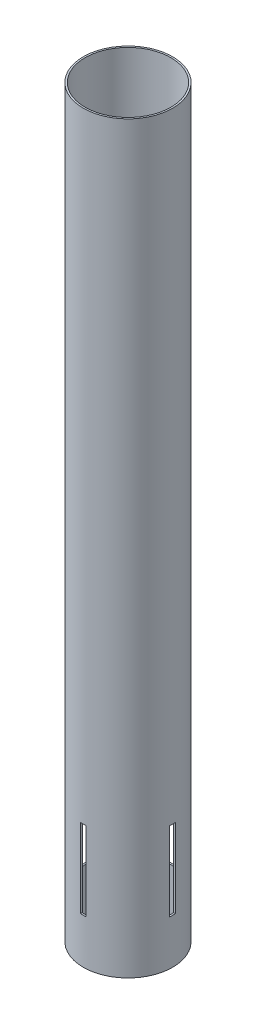
ISO-10303-21;
HEADER;
FILE_DESCRIPTION(('STEP AP214'),'2;1');
FILE_NAME('part.step','',(''),(''),'','','');
FILE_SCHEMA(('AUTOMOTIVE_DESIGN { 1 0 10303 214 1 1 1 1 }'));
ENDSEC;
DATA;
#1=APPLICATION_CONTEXT('core data for automotive mechanical design processes');
#2=APPLICATION_PROTOCOL_DEFINITION('international standard','automotive_design',2000,#1);
#3=PRODUCT_CONTEXT('',#1,'mechanical');
#4=PRODUCT('Part','Part','',(#3));
#5=PRODUCT_RELATED_PRODUCT_CATEGORY('part','',(#4));
#6=PRODUCT_DEFINITION_FORMATION('','',#4);
#7=PRODUCT_DEFINITION_CONTEXT('part definition',#1,'design');
#8=PRODUCT_DEFINITION('design','',#6,#7);
#9=PRODUCT_DEFINITION_SHAPE('','',#8);
#10=(LENGTH_UNIT() NAMED_UNIT(*) SI_UNIT(.MILLI.,.METRE.));
#11=(NAMED_UNIT(*) PLANE_ANGLE_UNIT() SI_UNIT($,.RADIAN.));
#12=(NAMED_UNIT(*) SI_UNIT($,.STERADIAN.) SOLID_ANGLE_UNIT());
#13=UNCERTAINTY_MEASURE_WITH_UNIT(LENGTH_MEASURE(1.E-05),#10,'distance_accuracy_value','');
#14=(GEOMETRIC_REPRESENTATION_CONTEXT(3) GLOBAL_UNCERTAINTY_ASSIGNED_CONTEXT((#13)) GLOBAL_UNIT_ASSIGNED_CONTEXT((#10,
#11,#12)) REPRESENTATION_CONTEXT('',''));
#15=CARTESIAN_POINT('',(0.,0.,0.));
#16=DIRECTION('',(0.,0.,1.));
#17=DIRECTION('',(1.,0.,0.));
#18=AXIS2_PLACEMENT_3D('',#15,#16,#17);
#19=CARTESIAN_POINT('',(0.,660.,0.));
#20=DIRECTION('',(0.,1.,0.));
#21=DIRECTION('',(0.,0.,1.));
#22=AXIS2_PLACEMENT_3D('',#19,#20,#21);
#23=PLANE('',#22);
#24=CARTESIAN_POINT('',(0.,660.,0.));
#25=DIRECTION('',(0.,1.,0.));
#26=DIRECTION('',(0.,0.,1.));
#27=AXIS2_PLACEMENT_3D('',#24,#25,#26);
#28=CIRCLE('',#27,39.6);
#29=CARTESIAN_POINT('',(0.,660.,39.6));
#30=VERTEX_POINT('',#29);
#31=EDGE_CURVE('E323',#30,#30,#28,.T.);
#32=ORIENTED_EDGE('',*,*,#31,.T.);
#33=EDGE_LOOP('',(#32));
#34=FACE_BOUND('',#33,.T.);
#35=CARTESIAN_POINT('',(0.,660.,0.));
#36=DIRECTION('',(0.,1.,0.));
#37=DIRECTION('',(0.,0.,1.));
#38=AXIS2_PLACEMENT_3D('',#35,#36,#37);
#39=CIRCLE('',#38,38.1);
#40=CARTESIAN_POINT('',(0.,660.,38.1));
#41=VERTEX_POINT('',#40);
#42=EDGE_CURVE('E315',#41,#41,#39,.T.);
#43=ORIENTED_EDGE('',*,*,#42,.F.);
#44=EDGE_LOOP('',(#43));
#45=FACE_BOUND('',#44,.T.);
#46=ADVANCED_FACE('F39',(#34,#45),#23,.T.);
#47=CARTESIAN_POINT('',(0.,0.,0.));
#48=DIRECTION('',(0.,1.,0.));
#49=DIRECTION('',(0.,0.,1.));
#50=AXIS2_PLACEMENT_3D('',#47,#48,#49);
#51=PLANE('',#50);
#52=CARTESIAN_POINT('',(0.,0.,0.));
#53=DIRECTION('',(0.,1.,0.));
#54=DIRECTION('',(0.,0.,1.));
#55=AXIS2_PLACEMENT_3D('',#52,#53,#54);
#56=CIRCLE('',#55,39.6);
#57=CARTESIAN_POINT('',(0.,0.,39.6));
#58=VERTEX_POINT('',#57);
#59=EDGE_CURVE('E319',#58,#58,#56,.T.);
#60=ORIENTED_EDGE('',*,*,#59,.F.);
#61=EDGE_LOOP('',(#60));
#62=FACE_BOUND('',#61,.T.);
#63=CARTESIAN_POINT('',(0.,0.,0.));
#64=DIRECTION('',(0.,1.,0.));
#65=DIRECTION('',(0.,0.,1.));
#66=AXIS2_PLACEMENT_3D('',#63,#64,#65);
#67=CIRCLE('',#66,38.1);
#68=CARTESIAN_POINT('',(0.,0.,38.1));
#69=VERTEX_POINT('',#68);
#70=EDGE_CURVE('E314',#69,#69,#67,.T.);
#71=ORIENTED_EDGE('',*,*,#70,.T.);
#72=EDGE_LOOP('',(#71));
#73=FACE_BOUND('',#72,.T.);
#74=ADVANCED_FACE('F372',(#62,#73),#51,.F.);
#75=CARTESIAN_POINT('',(0.,660.,0.));
#76=DIRECTION('',(0.,-1.,0.));
#77=DIRECTION('',(0.,0.,-1.));
#78=AXIS2_PLACEMENT_3D('',#75,#76,#77);
#79=CYLINDRICAL_SURFACE('',#78,39.6);
#80=DIRECTION('',(0.,-1.,0.));
#81=VECTOR('',#80,1.);
#82=CARTESIAN_POINT('',(-39.5210070721888,660.,2.50000000000014));
#83=LINE('',#82,#81);
#84=CARTESIAN_POINT('',(-39.5210070721888,110.,2.50000000000014));
#85=VERTEX_POINT('',#84);
#86=CARTESIAN_POINT('',(-39.5210070721888,40.,2.50000000000014));
#87=VERTEX_POINT('',#86);
#88=EDGE_CURVE('E244',#85,#87,#83,.T.);
#89=ORIENTED_EDGE('',*,*,#88,.T.);
#90=CARTESIAN_POINT('',(0.,40.,0.));
#91=DIRECTION('',(0.,-1.,0.));
#92=DIRECTION('',(0.,0.,-1.));
#93=AXIS2_PLACEMENT_3D('',#90,#91,#92);
#94=CIRCLE('',#93,39.6);
#95=CARTESIAN_POINT('',(-39.5210070721888,40.,-2.49999999999986));
#96=VERTEX_POINT('',#95);
#97=EDGE_CURVE('E55',#87,#96,#94,.T.);
#98=ORIENTED_EDGE('',*,*,#97,.T.);
#99=DIRECTION('',(0.,-1.,0.));
#100=VECTOR('',#99,1.);
#101=CARTESIAN_POINT('',(-39.5210070721888,660.,-2.49999999999986));
#102=LINE('',#101,#100);
#103=CARTESIAN_POINT('',(-39.5210070721888,110.,-2.49999999999986));
#104=VERTEX_POINT('',#103);
#105=EDGE_CURVE('E272',#96,#104,#102,.F.);
#106=ORIENTED_EDGE('',*,*,#105,.T.);
#107=CARTESIAN_POINT('',(0.,110.,0.));
#108=DIRECTION('',(0.,1.,0.));
#109=DIRECTION('',(0.,0.,1.));
#110=AXIS2_PLACEMENT_3D('',#107,#108,#109);
#111=CIRCLE('',#110,39.6);
#112=EDGE_CURVE('E232',#104,#85,#111,.T.);
#113=ORIENTED_EDGE('',*,*,#112,.T.);
#114=EDGE_LOOP('',(#89,#98,#106,#113));
#115=FACE_BOUND('',#114,.T.);
#116=CARTESIAN_POINT('',(-2.5,110.,39.5210070721888));
#117=VERTEX_POINT('',#116);
#118=CARTESIAN_POINT('',(2.5,110.,39.5210070721888));
#119=VERTEX_POINT('',#118);
#120=EDGE_CURVE('E280',#117,#119,#111,.T.);
#121=ORIENTED_EDGE('',*,*,#120,.T.);
#122=DIRECTION('',(0.,-1.,0.));
#123=VECTOR('',#122,1.);
#124=CARTESIAN_POINT('',(2.5,660.,39.5210070721888));
#125=LINE('',#124,#123);
#126=CARTESIAN_POINT('',(2.5,40.,39.5210070721888));
#127=VERTEX_POINT('',#126);
#128=EDGE_CURVE('E265',#119,#127,#125,.T.);
#129=ORIENTED_EDGE('',*,*,#128,.T.);
#130=CARTESIAN_POINT('',(-2.5,40.,39.5210070721888));
#131=VERTEX_POINT('',#130);
#132=EDGE_CURVE('E273',#127,#131,#94,.T.);
#133=ORIENTED_EDGE('',*,*,#132,.T.);
#134=DIRECTION('',(0.,-1.,0.));
#135=VECTOR('',#134,1.);
#136=CARTESIAN_POINT('',(-2.5,660.,39.5210070721888));
#137=LINE('',#136,#135);
#138=EDGE_CURVE('E249',#131,#117,#137,.F.);
#139=ORIENTED_EDGE('',*,*,#138,.T.);
#140=EDGE_LOOP('',(#121,#129,#133,#139));
#141=FACE_BOUND('',#140,.T.);
#142=DIRECTION('',(0.,-1.,0.));
#143=VECTOR('',#142,1.);
#144=CARTESIAN_POINT('',(39.5210070721888,660.,-2.50000000000014));
#145=LINE('',#144,#143);
#146=CARTESIAN_POINT('',(39.5210070721888,110.,-2.50000000000014));
#147=VERTEX_POINT('',#146);
#148=CARTESIAN_POINT('',(39.5210070721888,40.,-2.50000000000014));
#149=VERTEX_POINT('',#148);
#150=EDGE_CURVE('E276',#147,#149,#145,.T.);
#151=ORIENTED_EDGE('',*,*,#150,.T.);
#152=CARTESIAN_POINT('',(39.5210070721889,40.,2.49999999999959));
#153=VERTEX_POINT('',#152);
#154=EDGE_CURVE('E269',#149,#153,#94,.T.);
#155=ORIENTED_EDGE('',*,*,#154,.T.);
#156=DIRECTION('',(0.,-1.,0.));
#157=VECTOR('',#156,1.);
#158=CARTESIAN_POINT('',(39.5210070721889,660.,2.49999999999959));
#159=LINE('',#158,#157);
#160=CARTESIAN_POINT('',(39.5210070721889,110.,2.49999999999959));
#161=VERTEX_POINT('',#160);
#162=EDGE_CURVE('E246',#153,#161,#159,.F.);
#163=ORIENTED_EDGE('',*,*,#162,.T.);
#164=EDGE_CURVE('E175',#161,#147,#111,.T.);
#165=ORIENTED_EDGE('',*,*,#164,.T.);
#166=EDGE_LOOP('',(#151,#155,#163,#165));
#167=FACE_BOUND('',#166,.T.);
#168=DIRECTION('',(0.,-1.,0.));
#169=VECTOR('',#168,1.);
#170=CARTESIAN_POINT('',(2.5,660.,-39.5210070721888));
#171=LINE('',#170,#169);
#172=CARTESIAN_POINT('',(2.5,40.,-39.5210070721888));
#173=VERTEX_POINT('',#172);
#174=CARTESIAN_POINT('',(2.5,110.,-39.5210070721888));
#175=VERTEX_POINT('',#174);
#176=EDGE_CURVE('E303',#173,#175,#171,.F.);
#177=ORIENTED_EDGE('',*,*,#176,.T.);
#178=CARTESIAN_POINT('',(0.,110.,0.));
#179=DIRECTION('',(0.,1.,0.));
#180=DIRECTION('',(0.,0.,1.));
#181=AXIS2_PLACEMENT_3D('',#178,#179,#180);
#182=CIRCLE('',#181,39.6);
#183=CARTESIAN_POINT('',(-2.5,110.,-39.5210070721888));
#184=VERTEX_POINT('',#183);
#185=EDGE_CURVE('E307',#175,#184,#182,.T.);
#186=ORIENTED_EDGE('',*,*,#185,.T.);
#187=DIRECTION('',(0.,-1.,0.));
#188=VECTOR('',#187,1.);
#189=CARTESIAN_POINT('',(-2.5,660.,-39.5210070721888));
#190=LINE('',#189,#188);
#191=CARTESIAN_POINT('',(-2.5,40.,-39.5210070721888));
#192=VERTEX_POINT('',#191);
#193=EDGE_CURVE('E310',#184,#192,#190,.T.);
#194=ORIENTED_EDGE('',*,*,#193,.T.);
#195=CARTESIAN_POINT('',(0.,40.,0.));
#196=DIRECTION('',(0.,-1.,0.));
#197=DIRECTION('',(0.,0.,-1.));
#198=AXIS2_PLACEMENT_3D('',#195,#196,#197);
#199=CIRCLE('',#198,39.6);
#200=EDGE_CURVE('E290',#192,#173,#199,.T.);
#201=ORIENTED_EDGE('',*,*,#200,.T.);
#202=EDGE_LOOP('',(#177,#186,#194,#201));
#203=FACE_BOUND('',#202,.T.);
#204=ORIENTED_EDGE('',*,*,#31,.F.);
#205=EDGE_LOOP('',(#204));
#206=FACE_BOUND('',#205,.T.);
#207=ORIENTED_EDGE('',*,*,#59,.T.);
#208=EDGE_LOOP('',(#207));
#209=FACE_BOUND('',#208,.T.);
#210=ADVANCED_FACE('F41',(#115,#141,#167,#203,#206,#209),#79,.T.);
#211=CARTESIAN_POINT('',(0.,660.,0.));
#212=DIRECTION('',(0.,-1.,0.));
#213=DIRECTION('',(0.,0.,-1.));
#214=AXIS2_PLACEMENT_3D('',#211,#212,#213);
#215=CYLINDRICAL_SURFACE('',#214,38.1);
#216=DIRECTION('',(0.,-1.,0.));
#217=VECTOR('',#216,1.);
#218=CARTESIAN_POINT('',(-38.0178905253829,660.,2.50000000000014));
#219=LINE('',#218,#217);
#220=CARTESIAN_POINT('',(-38.0178905253829,110.,2.50000000000013));
#221=VERTEX_POINT('',#220);
#222=CARTESIAN_POINT('',(-38.0178905253829,40.,2.50000000000013));
#223=VERTEX_POINT('',#222);
#224=EDGE_CURVE('E11',#221,#223,#219,.T.);
#225=ORIENTED_EDGE('',*,*,#224,.F.);
#226=CARTESIAN_POINT('',(0.,110.,0.));
#227=DIRECTION('',(0.,1.,0.));
#228=DIRECTION('',(0.,0.,1.));
#229=AXIS2_PLACEMENT_3D('',#226,#227,#228);
#230=CIRCLE('',#229,38.1);
#231=CARTESIAN_POINT('',(-38.0178905253829,110.,-2.49999999999987));
#232=VERTEX_POINT('',#231);
#233=EDGE_CURVE('E48',#232,#221,#230,.T.);
#234=ORIENTED_EDGE('',*,*,#233,.F.);
#235=DIRECTION('',(0.,-1.,0.));
#236=VECTOR('',#235,1.);
#237=CARTESIAN_POINT('',(-38.0178905253829,660.,-2.49999999999987));
#238=LINE('',#237,#236);
#239=CARTESIAN_POINT('',(-38.0178905253829,40.,-2.49999999999987));
#240=VERTEX_POINT('',#239);
#241=EDGE_CURVE('E194',#240,#232,#238,.F.);
#242=ORIENTED_EDGE('',*,*,#241,.F.);
#243=CARTESIAN_POINT('',(0.,40.,0.));
#244=DIRECTION('',(0.,-1.,0.));
#245=DIRECTION('',(0.,0.,-1.));
#246=AXIS2_PLACEMENT_3D('',#243,#244,#245);
#247=CIRCLE('',#246,38.1);
#248=EDGE_CURVE('E203',#223,#240,#247,.T.);
#249=ORIENTED_EDGE('',*,*,#248,.F.);
#250=EDGE_LOOP('',(#225,#234,#242,#249));
#251=FACE_BOUND('',#250,.T.);
#252=DIRECTION('',(0.,-1.,0.));
#253=VECTOR('',#252,1.);
#254=CARTESIAN_POINT('',(2.5,660.,38.0178905253829));
#255=LINE('',#254,#253);
#256=CARTESIAN_POINT('',(2.5,110.,38.0178905253829));
#257=VERTEX_POINT('',#256);
#258=CARTESIAN_POINT('',(2.5,40.,38.0178905253829));
#259=VERTEX_POINT('',#258);
#260=EDGE_CURVE('E196',#257,#259,#255,.T.);
#261=ORIENTED_EDGE('',*,*,#260,.F.);
#262=CARTESIAN_POINT('',(-2.5,110.,38.0178905253829));
#263=VERTEX_POINT('',#262);
#264=EDGE_CURVE('E187',#263,#257,#230,.T.);
#265=ORIENTED_EDGE('',*,*,#264,.F.);
#266=DIRECTION('',(0.,-1.,0.));
#267=VECTOR('',#266,1.);
#268=CARTESIAN_POINT('',(-2.5,660.,38.0178905253829));
#269=LINE('',#268,#267);
#270=CARTESIAN_POINT('',(-2.5,40.,38.0178905253829));
#271=VERTEX_POINT('',#270);
#272=EDGE_CURVE('E185',#271,#263,#269,.F.);
#273=ORIENTED_EDGE('',*,*,#272,.F.);
#274=EDGE_CURVE('E190',#259,#271,#247,.T.);
#275=ORIENTED_EDGE('',*,*,#274,.F.);
#276=EDGE_LOOP('',(#261,#265,#273,#275));
#277=FACE_BOUND('',#276,.T.);
#278=CARTESIAN_POINT('',(38.0178905253829,110.,2.4999999999996));
#279=VERTEX_POINT('',#278);
#280=CARTESIAN_POINT('',(38.0178905253829,110.,-2.50000000000013));
#281=VERTEX_POINT('',#280);
#282=EDGE_CURVE('E173',#279,#281,#230,.T.);
#283=ORIENTED_EDGE('',*,*,#282,.F.);
#284=DIRECTION('',(0.,-1.,0.));
#285=VECTOR('',#284,1.);
#286=CARTESIAN_POINT('',(38.0178905253829,660.,2.49999999999961));
#287=LINE('',#286,#285);
#288=CARTESIAN_POINT('',(38.0178905253829,40.,2.49999999999961));
#289=VERTEX_POINT('',#288);
#290=EDGE_CURVE('E154',#289,#279,#287,.F.);
#291=ORIENTED_EDGE('',*,*,#290,.F.);
#292=CARTESIAN_POINT('',(38.0178905253829,40.,-2.50000000000013));
#293=VERTEX_POINT('',#292);
#294=EDGE_CURVE('E167',#293,#289,#247,.T.);
#295=ORIENTED_EDGE('',*,*,#294,.F.);
#296=DIRECTION('',(0.,-1.,0.));
#297=VECTOR('',#296,1.);
#298=CARTESIAN_POINT('',(38.0178905253829,660.,-2.50000000000014));
#299=LINE('',#298,#297);
#300=EDGE_CURVE('E183',#281,#293,#299,.T.);
#301=ORIENTED_EDGE('',*,*,#300,.F.);
#302=EDGE_LOOP('',(#283,#291,#295,#301));
#303=FACE_BOUND('',#302,.T.);
#304=DIRECTION('',(0.,-1.,0.));
#305=VECTOR('',#304,1.);
#306=CARTESIAN_POINT('',(-2.5,660.,-38.0178905253829));
#307=LINE('',#306,#305);
#308=CARTESIAN_POINT('',(-2.5,110.,-38.0178905253829));
#309=VERTEX_POINT('',#308);
#310=CARTESIAN_POINT('',(-2.5,40.,-38.0178905253829));
#311=VERTEX_POINT('',#310);
#312=EDGE_CURVE('E168',#309,#311,#307,.T.);
#313=ORIENTED_EDGE('',*,*,#312,.F.);
#314=CARTESIAN_POINT('',(0.,110.,0.));
#315=DIRECTION('',(0.,1.,0.));
#316=DIRECTION('',(0.,0.,1.));
#317=AXIS2_PLACEMENT_3D('',#314,#315,#316);
#318=CIRCLE('',#317,38.1);
#319=CARTESIAN_POINT('',(2.5,110.,-38.0178905253829));
#320=VERTEX_POINT('',#319);
#321=EDGE_CURVE('E336',#320,#309,#318,.T.);
#322=ORIENTED_EDGE('',*,*,#321,.F.);
#323=DIRECTION('',(0.,-1.,0.));
#324=VECTOR('',#323,1.);
#325=CARTESIAN_POINT('',(2.5,660.,-38.0178905253829));
#326=LINE('',#325,#324);
#327=CARTESIAN_POINT('',(2.5,40.,-38.0178905253829));
#328=VERTEX_POINT('',#327);
#329=EDGE_CURVE('E333',#328,#320,#326,.F.);
#330=ORIENTED_EDGE('',*,*,#329,.F.);
#331=CARTESIAN_POINT('',(0.,40.,0.));
#332=DIRECTION('',(0.,-1.,0.));
#333=DIRECTION('',(0.,0.,-1.));
#334=AXIS2_PLACEMENT_3D('',#331,#332,#333);
#335=CIRCLE('',#334,38.1);
#336=EDGE_CURVE('E327',#311,#328,#335,.T.);
#337=ORIENTED_EDGE('',*,*,#336,.F.);
#338=EDGE_LOOP('',(#313,#322,#330,#337));
#339=FACE_BOUND('',#338,.T.);
#340=ORIENTED_EDGE('',*,*,#42,.T.);
#341=EDGE_LOOP('',(#340));
#342=FACE_BOUND('',#341,.T.);
#343=ORIENTED_EDGE('',*,*,#70,.F.);
#344=EDGE_LOOP('',(#343));
#345=FACE_BOUND('',#344,.T.);
#346=ADVANCED_FACE('F181',(#251,#277,#303,#339,#342,#345),#215,.F.);
#347=CARTESIAN_POINT('',(-2.5,40.,-39.6));
#348=DIRECTION('',(-1.,0.,0.));
#349=DIRECTION('',(0.,-1.,0.));
#350=AXIS2_PLACEMENT_3D('',#347,#348,#349);
#351=PLANE('',#350);
#352=DIRECTION('',(0.,0.,1.));
#353=VECTOR('',#352,1.);
#354=CARTESIAN_POINT('',(-2.5,110.,-39.6));
#355=LINE('',#354,#353);
#356=EDGE_CURVE('E286',#184,#309,#355,.T.);
#357=ORIENTED_EDGE('',*,*,#356,.T.);
#358=ORIENTED_EDGE('',*,*,#312,.T.);
#359=DIRECTION('',(0.,0.,1.));
#360=VECTOR('',#359,1.);
#361=CARTESIAN_POINT('',(-2.5,40.,-39.6));
#362=LINE('',#361,#360);
#363=EDGE_CURVE('E285',#192,#311,#362,.T.);
#364=ORIENTED_EDGE('',*,*,#363,.F.);
#365=ORIENTED_EDGE('',*,*,#193,.F.);
#366=EDGE_LOOP('',(#357,#358,#364,#365));
#367=FACE_BOUND('',#366,.T.);
#368=ADVANCED_FACE('F345',(#367),#351,.F.);
#369=CARTESIAN_POINT('',(-2.5,110.,-39.6));
#370=DIRECTION('',(0.,1.,0.));
#371=DIRECTION('',(0.,0.,1.));
#372=AXIS2_PLACEMENT_3D('',#369,#370,#371);
#373=PLANE('',#372);
#374=DIRECTION('',(0.,0.,1.));
#375=VECTOR('',#374,1.);
#376=CARTESIAN_POINT('',(2.5,110.,-39.6));
#377=LINE('',#376,#375);
#378=EDGE_CURVE('E291',#175,#320,#377,.T.);
#379=ORIENTED_EDGE('',*,*,#378,.T.);
#380=ORIENTED_EDGE('',*,*,#321,.T.);
#381=ORIENTED_EDGE('',*,*,#356,.F.);
#382=ORIENTED_EDGE('',*,*,#185,.F.);
#383=EDGE_LOOP('',(#379,#380,#381,#382));
#384=FACE_BOUND('',#383,.T.);
#385=ADVANCED_FACE('F361',(#384),#373,.F.);
#386=CARTESIAN_POINT('',(2.5,40.,-39.6));
#387=DIRECTION('',(1.,0.,0.));
#388=DIRECTION('',(0.,1.,0.));
#389=AXIS2_PLACEMENT_3D('',#386,#387,#388);
#390=PLANE('',#389);
#391=DIRECTION('',(0.,0.,1.));
#392=VECTOR('',#391,1.);
#393=CARTESIAN_POINT('',(2.5,40.,-39.6));
#394=LINE('',#393,#392);
#395=EDGE_CURVE('E295',#173,#328,#394,.T.);
#396=ORIENTED_EDGE('',*,*,#395,.T.);
#397=ORIENTED_EDGE('',*,*,#329,.T.);
#398=ORIENTED_EDGE('',*,*,#378,.F.);
#399=ORIENTED_EDGE('',*,*,#176,.F.);
#400=EDGE_LOOP('',(#396,#397,#398,#399));
#401=FACE_BOUND('',#400,.T.);
#402=ADVANCED_FACE('F356',(#401),#390,.F.);
#403=CARTESIAN_POINT('',(-2.5,40.,-39.6));
#404=DIRECTION('',(0.,-1.,0.));
#405=DIRECTION('',(0.,0.,-1.));
#406=AXIS2_PLACEMENT_3D('',#403,#404,#405);
#407=PLANE('',#406);
#408=ORIENTED_EDGE('',*,*,#200,.F.);
#409=ORIENTED_EDGE('',*,*,#363,.T.);
#410=ORIENTED_EDGE('',*,*,#336,.T.);
#411=ORIENTED_EDGE('',*,*,#395,.F.);
#412=EDGE_LOOP('',(#408,#409,#410,#411));
#413=FACE_BOUND('',#412,.T.);
#414=ADVANCED_FACE('F353',(#413),#407,.F.);
#415=CARTESIAN_POINT('',(39.6000000000004,40.,2.49999999999959));
#416=DIRECTION('',(0.,0.,1.));
#417=DIRECTION('',(1.,0.,0.));
#418=AXIS2_PLACEMENT_3D('',#415,#416,#417);
#419=PLANE('',#418);
#420=DIRECTION('',(-1.,0.,0.));
#421=VECTOR('',#420,1.);
#422=CARTESIAN_POINT('',(39.6000000000004,40.,2.49999999999959));
#423=LINE('',#422,#421);
#424=EDGE_CURVE('E161',#153,#289,#423,.T.);
#425=ORIENTED_EDGE('',*,*,#424,.T.);
#426=ORIENTED_EDGE('',*,*,#290,.T.);
#427=DIRECTION('',(-1.,0.,0.));
#428=VECTOR('',#427,1.);
#429=CARTESIAN_POINT('',(39.6000000000004,110.,2.49999999999959));
#430=LINE('',#429,#428);
#431=EDGE_CURVE('E158',#161,#279,#430,.T.);
#432=ORIENTED_EDGE('',*,*,#431,.F.);
#433=ORIENTED_EDGE('',*,*,#162,.F.);
#434=EDGE_LOOP('',(#425,#426,#432,#433));
#435=FACE_BOUND('',#434,.T.);
#436=ADVANCED_FACE('F156',(#435),#419,.F.);
#437=CARTESIAN_POINT('',(-39.6000000000001,40.,2.50000000000014));
#438=DIRECTION('',(0.,-1.,0.));
#439=DIRECTION('',(0.,0.,-1.));
#440=AXIS2_PLACEMENT_3D('',#437,#438,#439);
#441=PLANE('',#440);
#442=DIRECTION('',(1.,0.,0.));
#443=VECTOR('',#442,1.);
#444=CARTESIAN_POINT('',(-39.6000000000002,40.,-2.49999999999986));
#445=LINE('',#444,#443);
#446=EDGE_CURVE('E255',#293,#149,#445,.T.);
#447=ORIENTED_EDGE('',*,*,#446,.F.);
#448=ORIENTED_EDGE('',*,*,#294,.T.);
#449=ORIENTED_EDGE('',*,*,#424,.F.);
#450=ORIENTED_EDGE('',*,*,#154,.F.);
#451=EDGE_LOOP('',(#447,#448,#449,#450));
#452=FACE_BOUND('',#451,.T.);
#453=ADVANCED_FACE('F387',(#452),#441,.F.);
#454=CARTESIAN_POINT('',(-39.6000000000002,40.,-2.49999999999986));
#455=DIRECTION('',(0.,0.,-1.));
#456=DIRECTION('',(-1.,0.,0.));
#457=AXIS2_PLACEMENT_3D('',#454,#455,#456);
#458=PLANE('',#457);
#459=DIRECTION('',(1.,0.,0.));
#460=VECTOR('',#459,1.);
#461=CARTESIAN_POINT('',(-39.6000000000002,110.,-2.49999999999986));
#462=LINE('',#461,#460);
#463=EDGE_CURVE('E235',#281,#147,#462,.T.);
#464=ORIENTED_EDGE('',*,*,#463,.F.);
#465=ORIENTED_EDGE('',*,*,#300,.T.);
#466=ORIENTED_EDGE('',*,*,#446,.T.);
#467=ORIENTED_EDGE('',*,*,#150,.F.);
#468=EDGE_LOOP('',(#464,#465,#466,#467));
#469=FACE_BOUND('',#468,.T.);
#470=ADVANCED_FACE('F392',(#469),#458,.F.);
#471=CARTESIAN_POINT('',(-39.6000000000001,110.,2.50000000000014));
#472=DIRECTION('',(0.,1.,0.));
#473=DIRECTION('',(0.,0.,1.));
#474=AXIS2_PLACEMENT_3D('',#471,#472,#473);
#475=PLANE('',#474);
#476=ORIENTED_EDGE('',*,*,#431,.T.);
#477=ORIENTED_EDGE('',*,*,#282,.T.);
#478=ORIENTED_EDGE('',*,*,#463,.T.);
#479=ORIENTED_EDGE('',*,*,#164,.F.);
#480=EDGE_LOOP('',(#476,#477,#478,#479));
#481=FACE_BOUND('',#480,.T.);
#482=ADVANCED_FACE('F171',(#481),#475,.F.);
#483=CARTESIAN_POINT('',(-2.5,40.,39.6));
#484=DIRECTION('',(-1.,0.,0.));
#485=DIRECTION('',(0.,-1.,0.));
#486=AXIS2_PLACEMENT_3D('',#483,#484,#485);
#487=PLANE('',#486);
#488=DIRECTION('',(0.,0.,-1.));
#489=VECTOR('',#488,1.);
#490=CARTESIAN_POINT('',(-2.5,40.,39.6));
#491=LINE('',#490,#489);
#492=EDGE_CURVE('E421',#131,#271,#491,.T.);
#493=ORIENTED_EDGE('',*,*,#492,.T.);
#494=ORIENTED_EDGE('',*,*,#272,.T.);
#495=DIRECTION('',(0.,0.,-1.));
#496=VECTOR('',#495,1.);
#497=CARTESIAN_POINT('',(-2.5,110.,39.6));
#498=LINE('',#497,#496);
#499=EDGE_CURVE('E63',#117,#263,#498,.T.);
#500=ORIENTED_EDGE('',*,*,#499,.F.);
#501=ORIENTED_EDGE('',*,*,#138,.F.);
#502=EDGE_LOOP('',(#493,#494,#500,#501));
#503=FACE_BOUND('',#502,.T.);
#504=ADVANCED_FACE('F398',(#503),#487,.F.);
#505=CARTESIAN_POINT('',(2.5,40.,39.6));
#506=DIRECTION('',(1.,0.,0.));
#507=DIRECTION('',(0.,1.,0.));
#508=AXIS2_PLACEMENT_3D('',#505,#506,#507);
#509=PLANE('',#508);
#510=DIRECTION('',(0.,0.,-1.));
#511=VECTOR('',#510,1.);
#512=CARTESIAN_POINT('',(2.5,110.,39.6));
#513=LINE('',#512,#511);
#514=EDGE_CURVE('E260',#119,#257,#513,.T.);
#515=ORIENTED_EDGE('',*,*,#514,.T.);
#516=ORIENTED_EDGE('',*,*,#260,.T.);
#517=DIRECTION('',(0.,0.,-1.));
#518=VECTOR('',#517,1.);
#519=CARTESIAN_POINT('',(2.5,40.,39.6));
#520=LINE('',#519,#518);
#521=EDGE_CURVE('E178',#127,#259,#520,.T.);
#522=ORIENTED_EDGE('',*,*,#521,.F.);
#523=ORIENTED_EDGE('',*,*,#128,.F.);
#524=EDGE_LOOP('',(#515,#516,#522,#523));
#525=FACE_BOUND('',#524,.T.);
#526=ADVANCED_FACE('F401',(#525),#509,.F.);
#527=ORIENTED_EDGE('',*,*,#521,.T.);
#528=ORIENTED_EDGE('',*,*,#274,.T.);
#529=ORIENTED_EDGE('',*,*,#492,.F.);
#530=ORIENTED_EDGE('',*,*,#132,.F.);
#531=EDGE_LOOP('',(#527,#528,#529,#530));
#532=FACE_BOUND('',#531,.T.);
#533=ADVANCED_FACE('F395',(#532),#441,.F.);
#534=ORIENTED_EDGE('',*,*,#120,.F.);
#535=ORIENTED_EDGE('',*,*,#499,.T.);
#536=ORIENTED_EDGE('',*,*,#264,.T.);
#537=ORIENTED_EDGE('',*,*,#514,.F.);
#538=EDGE_LOOP('',(#534,#535,#536,#537));
#539=FACE_BOUND('',#538,.T.);
#540=ADVANCED_FACE('F407',(#539),#475,.F.);
#541=CARTESIAN_POINT('',(-39.6000000000001,40.,2.50000000000014));
#542=DIRECTION('',(0.,0.,1.));
#543=DIRECTION('',(1.,0.,0.));
#544=AXIS2_PLACEMENT_3D('',#541,#542,#543);
#545=PLANE('',#544);
#546=DIRECTION('',(1.,0.,0.));
#547=VECTOR('',#546,1.);
#548=CARTESIAN_POINT('',(-39.6000000000001,110.,2.50000000000014));
#549=LINE('',#548,#547);
#550=EDGE_CURVE('E234',#85,#221,#549,.T.);
#551=ORIENTED_EDGE('',*,*,#550,.T.);
#552=ORIENTED_EDGE('',*,*,#224,.T.);
#553=DIRECTION('',(1.,0.,0.));
#554=VECTOR('',#553,1.);
#555=CARTESIAN_POINT('',(-39.6000000000001,40.,2.50000000000014));
#556=LINE('',#555,#554);
#557=EDGE_CURVE('E243',#87,#223,#556,.T.);
#558=ORIENTED_EDGE('',*,*,#557,.F.);
#559=ORIENTED_EDGE('',*,*,#88,.F.);
#560=EDGE_LOOP('',(#551,#552,#558,#559));
#561=FACE_BOUND('',#560,.T.);
#562=ADVANCED_FACE('F241',(#561),#545,.F.);
#563=EDGE_CURVE('E224',#104,#232,#462,.T.);
#564=ORIENTED_EDGE('',*,*,#563,.T.);
#565=ORIENTED_EDGE('',*,*,#233,.T.);
#566=ORIENTED_EDGE('',*,*,#550,.F.);
#567=ORIENTED_EDGE('',*,*,#112,.F.);
#568=EDGE_LOOP('',(#564,#565,#566,#567));
#569=FACE_BOUND('',#568,.T.);
#570=ADVANCED_FACE('F229',(#569),#475,.F.);
#571=EDGE_CURVE('E225',#96,#240,#445,.T.);
#572=ORIENTED_EDGE('',*,*,#571,.T.);
#573=ORIENTED_EDGE('',*,*,#241,.T.);
#574=ORIENTED_EDGE('',*,*,#563,.F.);
#575=ORIENTED_EDGE('',*,*,#105,.F.);
#576=EDGE_LOOP('',(#572,#573,#574,#575));
#577=FACE_BOUND('',#576,.T.);
#578=ADVANCED_FACE('F222',(#577),#458,.F.);
#579=ORIENTED_EDGE('',*,*,#557,.T.);
#580=ORIENTED_EDGE('',*,*,#248,.T.);
#581=ORIENTED_EDGE('',*,*,#571,.F.);
#582=ORIENTED_EDGE('',*,*,#97,.F.);
#583=EDGE_LOOP('',(#579,#580,#581,#582));
#584=FACE_BOUND('',#583,.T.);
#585=ADVANCED_FACE('F396',(#584),#441,.F.);
#586=CLOSED_SHELL('',(#46,#74,#210,#346,#368,#385,#402,#414,#436,#453,#470,#482,#504,#526,#533,
#540,#562,#570,#578,#585));
#587=MANIFOLD_SOLID_BREP('B2',#586);
#588=ADVANCED_BREP_SHAPE_REPRESENTATION('',(#18,#587),#14);
#589=SHAPE_DEFINITION_REPRESENTATION(#9,#588);
ENDSEC;
END-ISO-10303-21;
